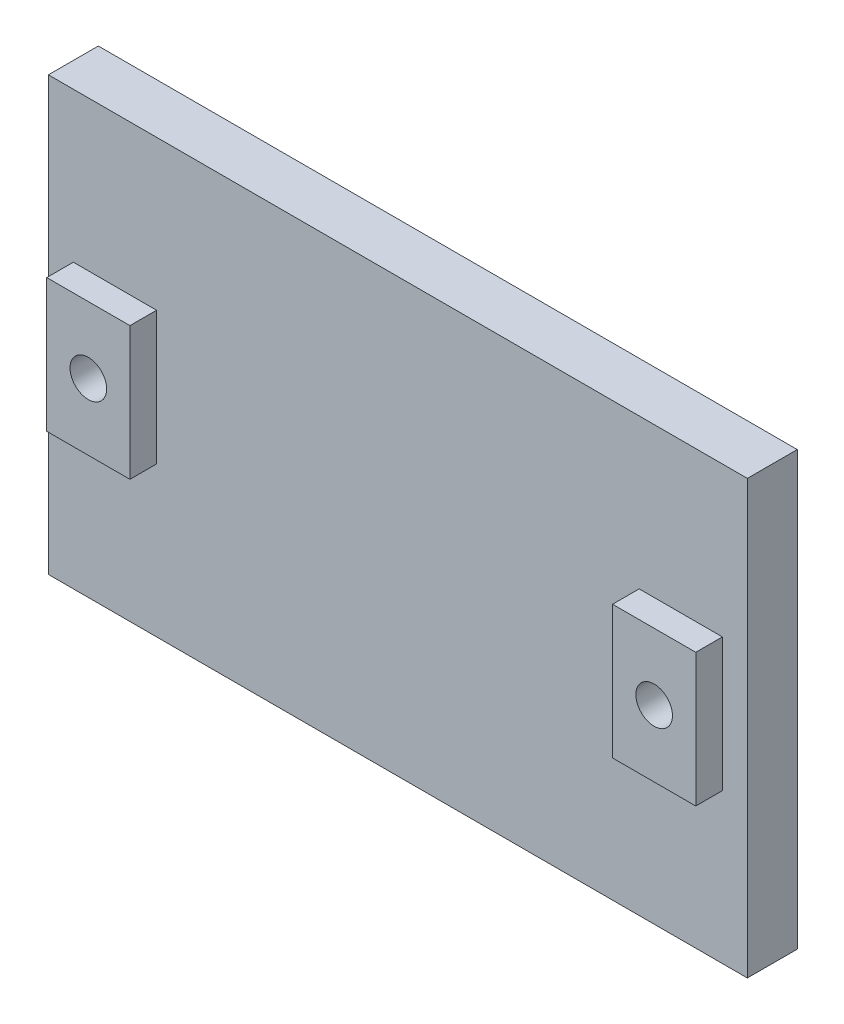
ISO-10303-21;
HEADER;
FILE_DESCRIPTION(('STEP AP214'),'2;1');
FILE_NAME('part.step','',(''),(''),'','','');
FILE_SCHEMA(('AUTOMOTIVE_DESIGN { 1 0 10303 214 1 1 1 1 }'));
ENDSEC;
DATA;
#1=APPLICATION_CONTEXT('core data for automotive mechanical design processes');
#2=APPLICATION_PROTOCOL_DEFINITION('international standard','automotive_design',2000,#1);
#3=PRODUCT_CONTEXT('',#1,'mechanical');
#4=PRODUCT('Part','Part','',(#3));
#5=PRODUCT_RELATED_PRODUCT_CATEGORY('part','',(#4));
#6=PRODUCT_DEFINITION_FORMATION('','',#4);
#7=PRODUCT_DEFINITION_CONTEXT('part definition',#1,'design');
#8=PRODUCT_DEFINITION('design','',#6,#7);
#9=PRODUCT_DEFINITION_SHAPE('','',#8);
#10=(LENGTH_UNIT() NAMED_UNIT(*) SI_UNIT(.MILLI.,.METRE.));
#11=(NAMED_UNIT(*) PLANE_ANGLE_UNIT() SI_UNIT($,.RADIAN.));
#12=(NAMED_UNIT(*) SI_UNIT($,.STERADIAN.) SOLID_ANGLE_UNIT());
#13=UNCERTAINTY_MEASURE_WITH_UNIT(LENGTH_MEASURE(1.E-05),#10,'distance_accuracy_value','');
#14=(GEOMETRIC_REPRESENTATION_CONTEXT(3) GLOBAL_UNCERTAINTY_ASSIGNED_CONTEXT((#13)) GLOBAL_UNIT_ASSIGNED_CONTEXT((#10,
#11,#12)) REPRESENTATION_CONTEXT('',''));
#15=CARTESIAN_POINT('',(0.,0.,0.));
#16=DIRECTION('',(0.,0.,1.));
#17=DIRECTION('',(1.,0.,0.));
#18=AXIS2_PLACEMENT_3D('',#15,#16,#17);
#19=CARTESIAN_POINT('',(0.,0.,3.));
#20=DIRECTION('',(0.,0.,1.));
#21=DIRECTION('',(1.,0.,0.));
#22=AXIS2_PLACEMENT_3D('',#19,#20,#21);
#23=PLANE('',#22);
#24=DIRECTION('',(0.,-1.,0.));
#25=VECTOR('',#24,1.);
#26=CARTESIAN_POINT('',(-21.,13.,3.));
#27=LINE('',#26,#25);
#28=CARTESIAN_POINT('',(-21.,13.,3.));
#29=VERTEX_POINT('',#28);
#30=CARTESIAN_POINT('',(-21.,-13.,3.));
#31=VERTEX_POINT('',#30);
#32=EDGE_CURVE('E183',#29,#31,#27,.T.);
#33=ORIENTED_EDGE('',*,*,#32,.T.);
#34=DIRECTION('',(1.,0.,0.));
#35=VECTOR('',#34,1.);
#36=CARTESIAN_POINT('',(-21.,-13.,3.));
#37=LINE('',#36,#35);
#38=CARTESIAN_POINT('',(21.,-13.,3.));
#39=VERTEX_POINT('',#38);
#40=EDGE_CURVE('E186',#31,#39,#37,.T.);
#41=ORIENTED_EDGE('',*,*,#40,.T.);
#42=DIRECTION('',(0.,1.,0.));
#43=VECTOR('',#42,1.);
#44=CARTESIAN_POINT('',(21.,-13.,3.));
#45=LINE('',#44,#43);
#46=CARTESIAN_POINT('',(21.,13.,3.));
#47=VERTEX_POINT('',#46);
#48=EDGE_CURVE('E191',#39,#47,#45,.T.);
#49=ORIENTED_EDGE('',*,*,#48,.T.);
#50=DIRECTION('',(-1.,0.,0.));
#51=VECTOR('',#50,1.);
#52=CARTESIAN_POINT('',(21.,13.,3.));
#53=LINE('',#52,#51);
#54=EDGE_CURVE('E192',#47,#29,#53,.T.);
#55=ORIENTED_EDGE('',*,*,#54,.T.);
#56=EDGE_LOOP('',(#33,#41,#49,#55));
#57=FACE_BOUND('',#56,.T.);
#58=DIRECTION('',(-1.,0.,0.));
#59=VECTOR('',#58,1.);
#60=CARTESIAN_POINT('',(0.,-4.,3.));
#61=LINE('',#60,#59);
#62=CARTESIAN_POINT('',(-14.5,-4.,3.));
#63=VERTEX_POINT('',#62);
#64=CARTESIAN_POINT('',(-19.5,-4.,3.));
#65=VERTEX_POINT('',#64);
#66=EDGE_CURVE('E219',#63,#65,#61,.T.);
#67=ORIENTED_EDGE('',*,*,#66,.T.);
#68=DIRECTION('',(0.,1.,0.));
#69=VECTOR('',#68,1.);
#70=CARTESIAN_POINT('',(-19.5,0.,3.));
#71=LINE('',#70,#69);
#72=CARTESIAN_POINT('',(-19.5,4.,3.));
#73=VERTEX_POINT('',#72);
#74=EDGE_CURVE('E224',#65,#73,#71,.T.);
#75=ORIENTED_EDGE('',*,*,#74,.T.);
#76=DIRECTION('',(1.,0.,0.));
#77=VECTOR('',#76,1.);
#78=CARTESIAN_POINT('',(0.,4.,3.));
#79=LINE('',#78,#77);
#80=CARTESIAN_POINT('',(-14.5,4.,3.));
#81=VERTEX_POINT('',#80);
#82=EDGE_CURVE('E212',#73,#81,#79,.T.);
#83=ORIENTED_EDGE('',*,*,#82,.T.);
#84=DIRECTION('',(0.,-1.,0.));
#85=VECTOR('',#84,1.);
#86=CARTESIAN_POINT('',(-14.5,0.,3.));
#87=LINE('',#86,#85);
#88=EDGE_CURVE('E220',#81,#63,#87,.T.);
#89=ORIENTED_EDGE('',*,*,#88,.T.);
#90=EDGE_LOOP('',(#67,#75,#83,#89));
#91=FACE_BOUND('',#90,.T.);
#92=DIRECTION('',(-1.,0.,0.));
#93=VECTOR('',#92,1.);
#94=CARTESIAN_POINT('',(0.,-4.,3.));
#95=LINE('',#94,#93);
#96=CARTESIAN_POINT('',(19.5,-4.,3.));
#97=VERTEX_POINT('',#96);
#98=CARTESIAN_POINT('',(14.5,-4.,3.));
#99=VERTEX_POINT('',#98);
#100=EDGE_CURVE('E49',#97,#99,#95,.T.);
#101=ORIENTED_EDGE('',*,*,#100,.T.);
#102=DIRECTION('',(0.,1.,0.));
#103=VECTOR('',#102,1.);
#104=CARTESIAN_POINT('',(14.5,0.,3.));
#105=LINE('',#104,#103);
#106=CARTESIAN_POINT('',(14.5,4.,3.));
#107=VERTEX_POINT('',#106);
#108=EDGE_CURVE('E11',#99,#107,#105,.T.);
#109=ORIENTED_EDGE('',*,*,#108,.T.);
#110=DIRECTION('',(1.,0.,0.));
#111=VECTOR('',#110,1.);
#112=CARTESIAN_POINT('',(0.,4.,3.));
#113=LINE('',#112,#111);
#114=CARTESIAN_POINT('',(19.5,4.,3.));
#115=VERTEX_POINT('',#114);
#116=EDGE_CURVE('E228',#107,#115,#113,.T.);
#117=ORIENTED_EDGE('',*,*,#116,.T.);
#118=DIRECTION('',(0.,-1.,0.));
#119=VECTOR('',#118,1.);
#120=CARTESIAN_POINT('',(19.5,0.,3.));
#121=LINE('',#120,#119);
#122=EDGE_CURVE('E237',#115,#97,#121,.T.);
#123=ORIENTED_EDGE('',*,*,#122,.T.);
#124=EDGE_LOOP('',(#101,#109,#117,#123));
#125=FACE_BOUND('',#124,.T.);
#126=ADVANCED_FACE('F41',(#57,#91,#125),#23,.T.);
#127=CARTESIAN_POINT('',(-21.,13.,3.));
#128=DIRECTION('',(1.,0.,0.));
#129=DIRECTION('',(0.,0.,-1.));
#130=AXIS2_PLACEMENT_3D('',#127,#128,#129);
#131=PLANE('',#130);
#132=DIRECTION('',(0.,-1.,0.));
#133=VECTOR('',#132,1.);
#134=CARTESIAN_POINT('',(-21.,13.,0.));
#135=LINE('',#134,#133);
#136=CARTESIAN_POINT('',(-21.,13.,0.));
#137=VERTEX_POINT('',#136);
#138=CARTESIAN_POINT('',(-21.,-13.,0.));
#139=VERTEX_POINT('',#138);
#140=EDGE_CURVE('E184',#137,#139,#135,.T.);
#141=ORIENTED_EDGE('',*,*,#140,.T.);
#142=DIRECTION('',(0.,0.,-1.));
#143=VECTOR('',#142,1.);
#144=CARTESIAN_POINT('',(-21.,-13.,3.));
#145=LINE('',#144,#143);
#146=EDGE_CURVE('E211',#31,#139,#145,.T.);
#147=ORIENTED_EDGE('',*,*,#146,.F.);
#148=ORIENTED_EDGE('',*,*,#32,.F.);
#149=DIRECTION('',(0.,0.,-1.));
#150=VECTOR('',#149,1.);
#151=CARTESIAN_POINT('',(-21.,13.,3.));
#152=LINE('',#151,#150);
#153=EDGE_CURVE('E194',#29,#137,#152,.T.);
#154=ORIENTED_EDGE('',*,*,#153,.T.);
#155=EDGE_LOOP('',(#141,#147,#148,#154));
#156=FACE_BOUND('',#155,.T.);
#157=ADVANCED_FACE('F43',(#156),#131,.F.);
#158=CARTESIAN_POINT('',(-21.,-13.,3.));
#159=DIRECTION('',(0.,1.,0.));
#160=DIRECTION('',(0.,0.,1.));
#161=AXIS2_PLACEMENT_3D('',#158,#159,#160);
#162=PLANE('',#161);
#163=DIRECTION('',(1.,0.,0.));
#164=VECTOR('',#163,1.);
#165=CARTESIAN_POINT('',(-21.,-13.,0.));
#166=LINE('',#165,#164);
#167=CARTESIAN_POINT('',(21.,-13.,0.));
#168=VERTEX_POINT('',#167);
#169=EDGE_CURVE('E196',#139,#168,#166,.T.);
#170=ORIENTED_EDGE('',*,*,#169,.T.);
#171=DIRECTION('',(0.,0.,-1.));
#172=VECTOR('',#171,1.);
#173=CARTESIAN_POINT('',(21.,-13.,3.));
#174=LINE('',#173,#172);
#175=EDGE_CURVE('E208',#39,#168,#174,.T.);
#176=ORIENTED_EDGE('',*,*,#175,.F.);
#177=ORIENTED_EDGE('',*,*,#40,.F.);
#178=ORIENTED_EDGE('',*,*,#146,.T.);
#179=EDGE_LOOP('',(#170,#176,#177,#178));
#180=FACE_BOUND('',#179,.T.);
#181=ADVANCED_FACE('F280',(#180),#162,.F.);
#182=CARTESIAN_POINT('',(21.,-13.,3.));
#183=DIRECTION('',(-1.,0.,0.));
#184=DIRECTION('',(0.,0.,1.));
#185=AXIS2_PLACEMENT_3D('',#182,#183,#184);
#186=PLANE('',#185);
#187=DIRECTION('',(0.,1.,0.));
#188=VECTOR('',#187,1.);
#189=CARTESIAN_POINT('',(21.,-13.,0.));
#190=LINE('',#189,#188);
#191=CARTESIAN_POINT('',(21.,13.,0.));
#192=VERTEX_POINT('',#191);
#193=EDGE_CURVE('E199',#168,#192,#190,.T.);
#194=ORIENTED_EDGE('',*,*,#193,.T.);
#195=DIRECTION('',(0.,0.,-1.));
#196=VECTOR('',#195,1.);
#197=CARTESIAN_POINT('',(21.,13.,3.));
#198=LINE('',#197,#196);
#199=EDGE_CURVE('E202',#47,#192,#198,.T.);
#200=ORIENTED_EDGE('',*,*,#199,.F.);
#201=ORIENTED_EDGE('',*,*,#48,.F.);
#202=ORIENTED_EDGE('',*,*,#175,.T.);
#203=EDGE_LOOP('',(#194,#200,#201,#202));
#204=FACE_BOUND('',#203,.T.);
#205=ADVANCED_FACE('F292',(#204),#186,.F.);
#206=CARTESIAN_POINT('',(21.,13.,3.));
#207=DIRECTION('',(0.,-1.,0.));
#208=DIRECTION('',(0.,0.,-1.));
#209=AXIS2_PLACEMENT_3D('',#206,#207,#208);
#210=PLANE('',#209);
#211=DIRECTION('',(-1.,0.,0.));
#212=VECTOR('',#211,1.);
#213=CARTESIAN_POINT('',(21.,13.,0.));
#214=LINE('',#213,#212);
#215=EDGE_CURVE('E187',#192,#137,#214,.T.);
#216=ORIENTED_EDGE('',*,*,#215,.T.);
#217=ORIENTED_EDGE('',*,*,#153,.F.);
#218=ORIENTED_EDGE('',*,*,#54,.F.);
#219=ORIENTED_EDGE('',*,*,#199,.T.);
#220=EDGE_LOOP('',(#216,#217,#218,#219));
#221=FACE_BOUND('',#220,.T.);
#222=ADVANCED_FACE('F290',(#221),#210,.F.);
#223=CARTESIAN_POINT('',(0.,0.,0.));
#224=DIRECTION('',(0.,0.,1.));
#225=DIRECTION('',(1.,0.,0.));
#226=AXIS2_PLACEMENT_3D('',#223,#224,#225);
#227=PLANE('',#226);
#228=CARTESIAN_POINT('',(17.,0.,0.));
#229=DIRECTION('',(0.,0.,1.));
#230=DIRECTION('',(1.,0.,0.));
#231=AXIS2_PLACEMENT_3D('',#228,#229,#230);
#232=CIRCLE('',#231,1.6);
#233=CARTESIAN_POINT('',(18.6,0.,0.));
#234=VERTEX_POINT('',#233);
#235=EDGE_CURVE('E44',#234,#234,#232,.F.);
#236=ORIENTED_EDGE('',*,*,#235,.F.);
#237=EDGE_LOOP('',(#236));
#238=FACE_BOUND('',#237,.T.);
#239=CARTESIAN_POINT('',(-17.,0.,0.));
#240=DIRECTION('',(0.,0.,1.));
#241=DIRECTION('',(1.,0.,0.));
#242=AXIS2_PLACEMENT_3D('',#239,#240,#241);
#243=CIRCLE('',#242,1.6);
#244=CARTESIAN_POINT('',(-15.4,0.,0.));
#245=VERTEX_POINT('',#244);
#246=EDGE_CURVE('E227',#245,#245,#243,.F.);
#247=ORIENTED_EDGE('',*,*,#246,.F.);
#248=EDGE_LOOP('',(#247));
#249=FACE_BOUND('',#248,.T.);
#250=ORIENTED_EDGE('',*,*,#140,.F.);
#251=ORIENTED_EDGE('',*,*,#215,.F.);
#252=ORIENTED_EDGE('',*,*,#193,.F.);
#253=ORIENTED_EDGE('',*,*,#169,.F.);
#254=EDGE_LOOP('',(#250,#251,#252,#253));
#255=FACE_BOUND('',#254,.T.);
#256=ADVANCED_FACE('F282',(#238,#249,#255),#227,.F.);
#257=CARTESIAN_POINT('',(-19.5,4.,4.6));
#258=DIRECTION('',(1.,0.,0.));
#259=DIRECTION('',(0.,0.,-1.));
#260=AXIS2_PLACEMENT_3D('',#257,#258,#259);
#261=PLANE('',#260);
#262=ORIENTED_EDGE('',*,*,#74,.F.);
#263=DIRECTION('',(0.,0.,-1.));
#264=VECTOR('',#263,1.);
#265=CARTESIAN_POINT('',(-19.5,-4.,4.6));
#266=LINE('',#265,#264);
#267=CARTESIAN_POINT('',(-19.5,-4.,4.6));
#268=VERTEX_POINT('',#267);
#269=EDGE_CURVE('E182',#268,#65,#266,.T.);
#270=ORIENTED_EDGE('',*,*,#269,.F.);
#271=DIRECTION('',(0.,-1.,0.));
#272=VECTOR('',#271,1.);
#273=CARTESIAN_POINT('',(-19.5,4.,4.6));
#274=LINE('',#273,#272);
#275=CARTESIAN_POINT('',(-19.5,4.,4.6));
#276=VERTEX_POINT('',#275);
#277=EDGE_CURVE('E163',#276,#268,#274,.T.);
#278=ORIENTED_EDGE('',*,*,#277,.F.);
#279=DIRECTION('',(0.,0.,-1.));
#280=VECTOR('',#279,1.);
#281=CARTESIAN_POINT('',(-19.5,4.,4.6));
#282=LINE('',#281,#280);
#283=EDGE_CURVE('E172',#276,#73,#282,.T.);
#284=ORIENTED_EDGE('',*,*,#283,.T.);
#285=EDGE_LOOP('',(#262,#270,#278,#284));
#286=FACE_BOUND('',#285,.T.);
#287=ADVANCED_FACE('F285',(#286),#261,.F.);
#288=CARTESIAN_POINT('',(-19.5,-4.,4.6));
#289=DIRECTION('',(0.,1.,0.));
#290=DIRECTION('',(0.,0.,1.));
#291=AXIS2_PLACEMENT_3D('',#288,#289,#290);
#292=PLANE('',#291);
#293=ORIENTED_EDGE('',*,*,#66,.F.);
#294=DIRECTION('',(0.,0.,-1.));
#295=VECTOR('',#294,1.);
#296=CARTESIAN_POINT('',(-14.5,-4.,4.6));
#297=LINE('',#296,#295);
#298=CARTESIAN_POINT('',(-14.5,-4.,4.6));
#299=VERTEX_POINT('',#298);
#300=EDGE_CURVE('E177',#299,#63,#297,.T.);
#301=ORIENTED_EDGE('',*,*,#300,.F.);
#302=DIRECTION('',(1.,0.,0.));
#303=VECTOR('',#302,1.);
#304=CARTESIAN_POINT('',(-19.5,-4.,4.6));
#305=LINE('',#304,#303);
#306=EDGE_CURVE('E170',#268,#299,#305,.T.);
#307=ORIENTED_EDGE('',*,*,#306,.F.);
#308=ORIENTED_EDGE('',*,*,#269,.T.);
#309=EDGE_LOOP('',(#293,#301,#307,#308));
#310=FACE_BOUND('',#309,.T.);
#311=ADVANCED_FACE('F329',(#310),#292,.F.);
#312=CARTESIAN_POINT('',(-14.5,-4.,4.6));
#313=DIRECTION('',(-1.,0.,0.));
#314=DIRECTION('',(0.,0.,1.));
#315=AXIS2_PLACEMENT_3D('',#312,#313,#314);
#316=PLANE('',#315);
#317=ORIENTED_EDGE('',*,*,#88,.F.);
#318=DIRECTION('',(0.,0.,-1.));
#319=VECTOR('',#318,1.);
#320=CARTESIAN_POINT('',(-14.5,4.,4.6));
#321=LINE('',#320,#319);
#322=CARTESIAN_POINT('',(-14.5,4.,4.6));
#323=VERTEX_POINT('',#322);
#324=EDGE_CURVE('E66',#323,#81,#321,.T.);
#325=ORIENTED_EDGE('',*,*,#324,.F.);
#326=DIRECTION('',(0.,1.,0.));
#327=VECTOR('',#326,1.);
#328=CARTESIAN_POINT('',(-14.5,-4.,4.6));
#329=LINE('',#328,#327);
#330=EDGE_CURVE('E168',#299,#323,#329,.T.);
#331=ORIENTED_EDGE('',*,*,#330,.F.);
#332=ORIENTED_EDGE('',*,*,#300,.T.);
#333=EDGE_LOOP('',(#317,#325,#331,#332));
#334=FACE_BOUND('',#333,.T.);
#335=ADVANCED_FACE('F336',(#334),#316,.F.);
#336=CARTESIAN_POINT('',(-14.5,4.,4.6));
#337=DIRECTION('',(0.,-1.,0.));
#338=DIRECTION('',(0.,0.,-1.));
#339=AXIS2_PLACEMENT_3D('',#336,#337,#338);
#340=PLANE('',#339);
#341=ORIENTED_EDGE('',*,*,#82,.F.);
#342=ORIENTED_EDGE('',*,*,#283,.F.);
#343=DIRECTION('',(-1.,0.,0.));
#344=VECTOR('',#343,1.);
#345=CARTESIAN_POINT('',(-14.5,4.,4.6));
#346=LINE('',#345,#344);
#347=EDGE_CURVE('E175',#323,#276,#346,.T.);
#348=ORIENTED_EDGE('',*,*,#347,.F.);
#349=ORIENTED_EDGE('',*,*,#324,.T.);
#350=EDGE_LOOP('',(#341,#342,#348,#349));
#351=FACE_BOUND('',#350,.T.);
#352=ADVANCED_FACE('F347',(#351),#340,.F.);
#353=CARTESIAN_POINT('',(0.,0.,4.6));
#354=DIRECTION('',(0.,0.,1.));
#355=DIRECTION('',(1.,0.,0.));
#356=AXIS2_PLACEMENT_3D('',#353,#354,#355);
#357=PLANE('',#356);
#358=CARTESIAN_POINT('',(-17.,0.,4.6));
#359=DIRECTION('',(0.,0.,1.));
#360=DIRECTION('',(1.,0.,0.));
#361=AXIS2_PLACEMENT_3D('',#358,#359,#360);
#362=CIRCLE('',#361,1.1);
#363=CARTESIAN_POINT('',(-15.9,0.,4.6));
#364=VERTEX_POINT('',#363);
#365=EDGE_CURVE('E169',#364,#364,#362,.F.);
#366=ORIENTED_EDGE('',*,*,#365,.T.);
#367=EDGE_LOOP('',(#366));
#368=FACE_BOUND('',#367,.T.);
#369=ORIENTED_EDGE('',*,*,#277,.T.);
#370=ORIENTED_EDGE('',*,*,#306,.T.);
#371=ORIENTED_EDGE('',*,*,#330,.T.);
#372=ORIENTED_EDGE('',*,*,#347,.T.);
#373=EDGE_LOOP('',(#369,#370,#371,#372));
#374=FACE_BOUND('',#373,.T.);
#375=ADVANCED_FACE('F354',(#368,#374),#357,.T.);
#376=CARTESIAN_POINT('',(-17.,0.,4.7));
#377=DIRECTION('',(0.,0.,-1.));
#378=DIRECTION('',(-1.,0.,0.));
#379=AXIS2_PLACEMENT_3D('',#376,#377,#378);
#380=CYLINDRICAL_SURFACE('',#379,1.1);
#381=CARTESIAN_POINT('',(-17.,0.,2.4));
#382=DIRECTION('',(0.,0.,1.));
#383=DIRECTION('',(1.,0.,0.));
#384=AXIS2_PLACEMENT_3D('',#381,#382,#383);
#385=CIRCLE('',#384,1.1);
#386=CARTESIAN_POINT('',(-15.9,0.,2.4));
#387=VERTEX_POINT('',#386);
#388=EDGE_CURVE('E157',#387,#387,#385,.T.);
#389=ORIENTED_EDGE('',*,*,#388,.F.);
#390=EDGE_LOOP('',(#389));
#391=FACE_BOUND('',#390,.T.);
#392=ORIENTED_EDGE('',*,*,#365,.F.);
#393=EDGE_LOOP('',(#392));
#394=FACE_BOUND('',#393,.T.);
#395=ADVANCED_FACE('F361',(#391,#394),#380,.F.);
#396=CARTESIAN_POINT('',(-17.,0.,2.4));
#397=DIRECTION('',(0.,0.,-1.));
#398=DIRECTION('',(-1.,0.,0.));
#399=AXIS2_PLACEMENT_3D('',#396,#397,#398);
#400=CYLINDRICAL_SURFACE('',#399,1.6);
#401=CARTESIAN_POINT('',(-17.,0.,2.4));
#402=DIRECTION('',(0.,0.,1.));
#403=DIRECTION('',(1.,0.,0.));
#404=AXIS2_PLACEMENT_3D('',#401,#402,#403);
#405=CIRCLE('',#404,1.6);
#406=CARTESIAN_POINT('',(-15.4,0.,2.4));
#407=VERTEX_POINT('',#406);
#408=EDGE_CURVE('E156',#407,#407,#405,.T.);
#409=ORIENTED_EDGE('',*,*,#408,.T.);
#410=EDGE_LOOP('',(#409));
#411=FACE_BOUND('',#410,.T.);
#412=ORIENTED_EDGE('',*,*,#246,.T.);
#413=EDGE_LOOP('',(#412));
#414=FACE_BOUND('',#413,.T.);
#415=ADVANCED_FACE('F375',(#411,#414),#400,.F.);
#416=CARTESIAN_POINT('',(-17.,0.,2.4));
#417=DIRECTION('',(0.,0.,1.));
#418=DIRECTION('',(1.,0.,0.));
#419=AXIS2_PLACEMENT_3D('',#416,#417,#418);
#420=PLANE('',#419);
#421=ORIENTED_EDGE('',*,*,#388,.T.);
#422=EDGE_LOOP('',(#421));
#423=FACE_BOUND('',#422,.T.);
#424=ORIENTED_EDGE('',*,*,#408,.F.);
#425=EDGE_LOOP('',(#424));
#426=FACE_BOUND('',#425,.T.);
#427=ADVANCED_FACE('F379',(#423,#426),#420,.F.);
#428=CARTESIAN_POINT('',(14.5,4.,4.6));
#429=DIRECTION('',(1.,0.,0.));
#430=DIRECTION('',(0.,0.,-1.));
#431=AXIS2_PLACEMENT_3D('',#428,#429,#430);
#432=PLANE('',#431);
#433=ORIENTED_EDGE('',*,*,#108,.F.);
#434=DIRECTION('',(0.,0.,-1.));
#435=VECTOR('',#434,1.);
#436=CARTESIAN_POINT('',(14.5,-4.,4.6));
#437=LINE('',#436,#435);
#438=CARTESIAN_POINT('',(14.5,-4.,4.6));
#439=VERTEX_POINT('',#438);
#440=EDGE_CURVE('E137',#439,#99,#437,.T.);
#441=ORIENTED_EDGE('',*,*,#440,.F.);
#442=DIRECTION('',(0.,-1.,0.));
#443=VECTOR('',#442,1.);
#444=CARTESIAN_POINT('',(14.5,4.,4.6));
#445=LINE('',#444,#443);
#446=CARTESIAN_POINT('',(14.5,4.,4.6));
#447=VERTEX_POINT('',#446);
#448=EDGE_CURVE('E144',#447,#439,#445,.T.);
#449=ORIENTED_EDGE('',*,*,#448,.F.);
#450=DIRECTION('',(0.,0.,-1.));
#451=VECTOR('',#450,1.);
#452=CARTESIAN_POINT('',(14.5,4.,4.6));
#453=LINE('',#452,#451);
#454=EDGE_CURVE('E255',#447,#107,#453,.T.);
#455=ORIENTED_EDGE('',*,*,#454,.T.);
#456=EDGE_LOOP('',(#433,#441,#449,#455));
#457=FACE_BOUND('',#456,.T.);
#458=ADVANCED_FACE('F154',(#457),#432,.F.);
#459=CARTESIAN_POINT('',(14.5,-4.,4.6));
#460=DIRECTION('',(0.,1.,0.));
#461=DIRECTION('',(0.,0.,1.));
#462=AXIS2_PLACEMENT_3D('',#459,#460,#461);
#463=PLANE('',#462);
#464=ORIENTED_EDGE('',*,*,#100,.F.);
#465=DIRECTION('',(0.,0.,-1.));
#466=VECTOR('',#465,1.);
#467=CARTESIAN_POINT('',(19.5,-4.,4.6));
#468=LINE('',#467,#466);
#469=CARTESIAN_POINT('',(19.5,-4.,4.6));
#470=VERTEX_POINT('',#469);
#471=EDGE_CURVE('E143',#470,#97,#468,.T.);
#472=ORIENTED_EDGE('',*,*,#471,.F.);
#473=DIRECTION('',(1.,0.,0.));
#474=VECTOR('',#473,1.);
#475=CARTESIAN_POINT('',(14.5,-4.,4.6));
#476=LINE('',#475,#474);
#477=EDGE_CURVE('E132',#439,#470,#476,.T.);
#478=ORIENTED_EDGE('',*,*,#477,.F.);
#479=ORIENTED_EDGE('',*,*,#440,.T.);
#480=EDGE_LOOP('',(#464,#472,#478,#479));
#481=FACE_BOUND('',#480,.T.);
#482=ADVANCED_FACE('F136',(#481),#463,.F.);
#483=CARTESIAN_POINT('',(19.5,-4.,4.6));
#484=DIRECTION('',(-1.,0.,0.));
#485=DIRECTION('',(0.,0.,1.));
#486=AXIS2_PLACEMENT_3D('',#483,#484,#485);
#487=PLANE('',#486);
#488=ORIENTED_EDGE('',*,*,#122,.F.);
#489=DIRECTION('',(0.,0.,-1.));
#490=VECTOR('',#489,1.);
#491=CARTESIAN_POINT('',(19.5,4.,4.6));
#492=LINE('',#491,#490);
#493=CARTESIAN_POINT('',(19.5,4.,4.6));
#494=VERTEX_POINT('',#493);
#495=EDGE_CURVE('E59',#494,#115,#492,.T.);
#496=ORIENTED_EDGE('',*,*,#495,.F.);
#497=DIRECTION('',(0.,1.,0.));
#498=VECTOR('',#497,1.);
#499=CARTESIAN_POINT('',(19.5,-4.,4.6));
#500=LINE('',#499,#498);
#501=EDGE_CURVE('E145',#470,#494,#500,.T.);
#502=ORIENTED_EDGE('',*,*,#501,.F.);
#503=ORIENTED_EDGE('',*,*,#471,.T.);
#504=EDGE_LOOP('',(#488,#496,#502,#503));
#505=FACE_BOUND('',#504,.T.);
#506=ADVANCED_FACE('F260',(#505),#487,.F.);
#507=CARTESIAN_POINT('',(19.5,4.,4.6));
#508=DIRECTION('',(0.,-1.,0.));
#509=DIRECTION('',(0.,0.,-1.));
#510=AXIS2_PLACEMENT_3D('',#507,#508,#509);
#511=PLANE('',#510);
#512=ORIENTED_EDGE('',*,*,#116,.F.);
#513=ORIENTED_EDGE('',*,*,#454,.F.);
#514=DIRECTION('',(-1.,0.,0.));
#515=VECTOR('',#514,1.);
#516=CARTESIAN_POINT('',(19.5,4.,4.6));
#517=LINE('',#516,#515);
#518=EDGE_CURVE('E149',#494,#447,#517,.T.);
#519=ORIENTED_EDGE('',*,*,#518,.F.);
#520=ORIENTED_EDGE('',*,*,#495,.T.);
#521=EDGE_LOOP('',(#512,#513,#519,#520));
#522=FACE_BOUND('',#521,.T.);
#523=ADVANCED_FACE('F256',(#522),#511,.F.);
#524=CARTESIAN_POINT('',(0.,0.,4.6));
#525=DIRECTION('',(0.,0.,1.));
#526=DIRECTION('',(1.,0.,0.));
#527=AXIS2_PLACEMENT_3D('',#524,#525,#526);
#528=PLANE('',#527);
#529=CARTESIAN_POINT('',(17.,0.,4.6));
#530=DIRECTION('',(0.,0.,1.));
#531=DIRECTION('',(1.,0.,0.));
#532=AXIS2_PLACEMENT_3D('',#529,#530,#531);
#533=CIRCLE('',#532,1.1);
#534=CARTESIAN_POINT('',(18.1,0.,4.6));
#535=VERTEX_POINT('',#534);
#536=EDGE_CURVE('E153',#535,#535,#533,.F.);
#537=ORIENTED_EDGE('',*,*,#536,.T.);
#538=EDGE_LOOP('',(#537));
#539=FACE_BOUND('',#538,.T.);
#540=ORIENTED_EDGE('',*,*,#448,.T.);
#541=ORIENTED_EDGE('',*,*,#477,.T.);
#542=ORIENTED_EDGE('',*,*,#501,.T.);
#543=ORIENTED_EDGE('',*,*,#518,.T.);
#544=EDGE_LOOP('',(#540,#541,#542,#543));
#545=FACE_BOUND('',#544,.T.);
#546=ADVANCED_FACE('F146',(#539,#545),#528,.T.);
#547=CARTESIAN_POINT('',(17.,0.,4.7));
#548=DIRECTION('',(0.,0.,-1.));
#549=DIRECTION('',(-1.,0.,0.));
#550=AXIS2_PLACEMENT_3D('',#547,#548,#549);
#551=CYLINDRICAL_SURFACE('',#550,1.1);
#552=CARTESIAN_POINT('',(17.,0.,2.4));
#553=DIRECTION('',(0.,0.,1.));
#554=DIRECTION('',(1.,0.,0.));
#555=AXIS2_PLACEMENT_3D('',#552,#553,#554);
#556=CIRCLE('',#555,1.1);
#557=CARTESIAN_POINT('',(18.1,0.,2.4));
#558=VERTEX_POINT('',#557);
#559=EDGE_CURVE('E243',#558,#558,#556,.T.);
#560=ORIENTED_EDGE('',*,*,#559,.F.);
#561=EDGE_LOOP('',(#560));
#562=FACE_BOUND('',#561,.T.);
#563=ORIENTED_EDGE('',*,*,#536,.F.);
#564=EDGE_LOOP('',(#563));
#565=FACE_BOUND('',#564,.T.);
#566=ADVANCED_FACE('F264',(#562,#565),#551,.F.);
#567=CARTESIAN_POINT('',(17.,0.,2.4));
#568=DIRECTION('',(0.,0.,-1.));
#569=DIRECTION('',(-1.,0.,0.));
#570=AXIS2_PLACEMENT_3D('',#567,#568,#569);
#571=CYLINDRICAL_SURFACE('',#570,1.6);
#572=CARTESIAN_POINT('',(17.,0.,2.4));
#573=DIRECTION('',(0.,0.,1.));
#574=DIRECTION('',(1.,0.,0.));
#575=AXIS2_PLACEMENT_3D('',#572,#573,#574);
#576=CIRCLE('',#575,1.6);
#577=CARTESIAN_POINT('',(18.6,0.,2.4));
#578=VERTEX_POINT('',#577);
#579=EDGE_CURVE('E241',#578,#578,#576,.T.);
#580=ORIENTED_EDGE('',*,*,#579,.T.);
#581=EDGE_LOOP('',(#580));
#582=FACE_BOUND('',#581,.T.);
#583=ORIENTED_EDGE('',*,*,#235,.T.);
#584=EDGE_LOOP('',(#583));
#585=FACE_BOUND('',#584,.T.);
#586=ADVANCED_FACE('F434',(#582,#585),#571,.F.);
#587=CARTESIAN_POINT('',(17.,0.,2.4));
#588=DIRECTION('',(0.,0.,1.));
#589=DIRECTION('',(1.,0.,0.));
#590=AXIS2_PLACEMENT_3D('',#587,#588,#589);
#591=PLANE('',#590);
#592=ORIENTED_EDGE('',*,*,#559,.T.);
#593=EDGE_LOOP('',(#592));
#594=FACE_BOUND('',#593,.T.);
#595=ORIENTED_EDGE('',*,*,#579,.F.);
#596=EDGE_LOOP('',(#595));
#597=FACE_BOUND('',#596,.T.);
#598=ADVANCED_FACE('F443',(#594,#597),#591,.F.);
#599=CLOSED_SHELL('',(#126,#157,#181,#205,#222,#256,#287,#311,#335,#352,#375,#395,#415,#427,
#458,#482,#506,#523,#546,#566,#586,#598));
#600=MANIFOLD_SOLID_BREP('B2',#599);
#601=ADVANCED_BREP_SHAPE_REPRESENTATION('',(#18,#600),#14);
#602=SHAPE_DEFINITION_REPRESENTATION(#9,#601);
ENDSEC;
END-ISO-10303-21;
